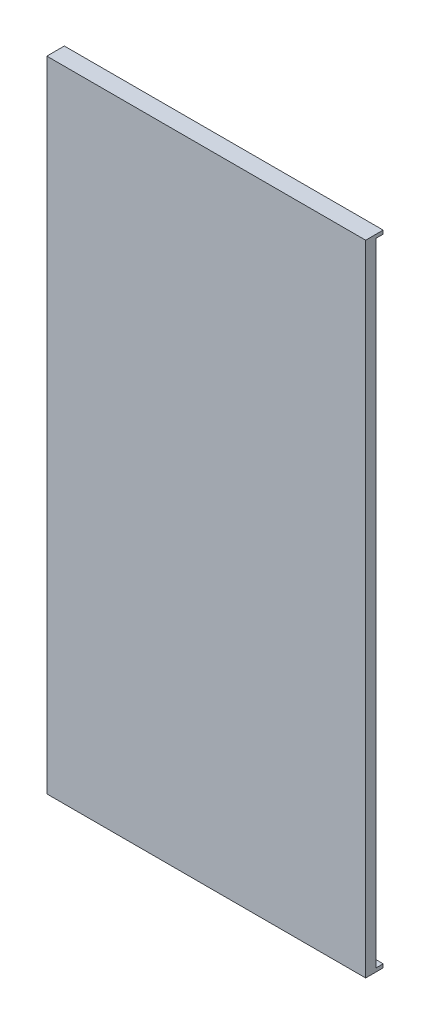
ISO-10303-21;
HEADER;
FILE_DESCRIPTION(('STEP AP214'),'2;1');
FILE_NAME('part.step','',(''),(''),'','','');
FILE_SCHEMA(('AUTOMOTIVE_DESIGN { 1 0 10303 214 1 1 1 1 }'));
ENDSEC;
DATA;
#1=APPLICATION_CONTEXT('core data for automotive mechanical design processes');
#2=APPLICATION_PROTOCOL_DEFINITION('international standard','automotive_design',2000,#1);
#3=PRODUCT_CONTEXT('',#1,'mechanical');
#4=PRODUCT('Part','Part','',(#3));
#5=PRODUCT_RELATED_PRODUCT_CATEGORY('part','',(#4));
#6=PRODUCT_DEFINITION_FORMATION('','',#4);
#7=PRODUCT_DEFINITION_CONTEXT('part definition',#1,'design');
#8=PRODUCT_DEFINITION('design','',#6,#7);
#9=PRODUCT_DEFINITION_SHAPE('','',#8);
#10=(LENGTH_UNIT() NAMED_UNIT(*) SI_UNIT(.MILLI.,.METRE.));
#11=(NAMED_UNIT(*) PLANE_ANGLE_UNIT() SI_UNIT($,.RADIAN.));
#12=(NAMED_UNIT(*) SI_UNIT($,.STERADIAN.) SOLID_ANGLE_UNIT());
#13=UNCERTAINTY_MEASURE_WITH_UNIT(LENGTH_MEASURE(1.E-05),#10,'distance_accuracy_value','');
#14=(GEOMETRIC_REPRESENTATION_CONTEXT(3) GLOBAL_UNCERTAINTY_ASSIGNED_CONTEXT((#13)) GLOBAL_UNIT_ASSIGNED_CONTEXT((#10,
#11,#12)) REPRESENTATION_CONTEXT('',''));
#15=CARTESIAN_POINT('',(0.,0.,0.));
#16=DIRECTION('',(0.,0.,1.));
#17=DIRECTION('',(1.,0.,0.));
#18=AXIS2_PLACEMENT_3D('',#15,#16,#17);
#19=CARTESIAN_POINT('',(222.,447.4,10.));
#20=DIRECTION('',(1.,0.,0.));
#21=DIRECTION('',(0.,0.,-1.));
#22=AXIS2_PLACEMENT_3D('',#19,#20,#21);
#23=PLANE('',#22);
#24=DIRECTION('',(0.,1.,0.));
#25=VECTOR('',#24,1.);
#26=CARTESIAN_POINT('',(222.,2.5,5.));
#27=LINE('',#26,#25);
#28=CARTESIAN_POINT('',(222.,2.5,5.));
#29=VERTEX_POINT('',#28);
#30=CARTESIAN_POINT('',(222.,447.4,5.));
#31=VERTEX_POINT('',#30);
#32=EDGE_CURVE('E55',#29,#31,#27,.T.);
#33=ORIENTED_EDGE('',*,*,#32,.F.);
#34=DIRECTION('',(0.,0.,-1.));
#35=VECTOR('',#34,1.);
#36=CARTESIAN_POINT('',(222.,2.5,10.));
#37=LINE('',#36,#35);
#38=CARTESIAN_POINT('',(222.,2.5,10.));
#39=VERTEX_POINT('',#38);
#40=EDGE_CURVE('E171',#39,#29,#37,.T.);
#41=ORIENTED_EDGE('',*,*,#40,.F.);
#42=DIRECTION('',(0.,-1.,0.));
#43=VECTOR('',#42,1.);
#44=CARTESIAN_POINT('',(222.,447.4,10.));
#45=LINE('',#44,#43);
#46=CARTESIAN_POINT('',(222.,447.4,10.));
#47=VERTEX_POINT('',#46);
#48=EDGE_CURVE('E158',#47,#39,#45,.T.);
#49=ORIENTED_EDGE('',*,*,#48,.F.);
#50=DIRECTION('',(0.,0.,-1.));
#51=VECTOR('',#50,1.);
#52=CARTESIAN_POINT('',(222.,447.4,10.));
#53=LINE('',#52,#51);
#54=EDGE_CURVE('E176',#47,#31,#53,.T.);
#55=ORIENTED_EDGE('',*,*,#54,.T.);
#56=EDGE_LOOP('',(#33,#41,#49,#55));
#57=FACE_BOUND('',#56,.T.);
#58=ADVANCED_FACE('F39',(#57),#23,.F.);
#59=CARTESIAN_POINT('',(0.,0.,12.33));
#60=DIRECTION('',(1.,0.,0.));
#61=DIRECTION('',(0.,0.,-1.));
#62=AXIS2_PLACEMENT_3D('',#59,#60,#61);
#63=PLANE('',#62);
#64=DIRECTION('',(0.,-1.,0.));
#65=VECTOR('',#64,1.);
#66=CARTESIAN_POINT('',(0.,0.,0.));
#67=LINE('',#66,#65);
#68=CARTESIAN_POINT('',(0.,449.9,0.));
#69=VERTEX_POINT('',#68);
#70=CARTESIAN_POINT('',(0.,0.,0.));
#71=VERTEX_POINT('',#70);
#72=EDGE_CURVE('E175',#69,#71,#67,.T.);
#73=ORIENTED_EDGE('',*,*,#72,.T.);
#74=DIRECTION('',(0.,0.,-1.));
#75=VECTOR('',#74,1.);
#76=CARTESIAN_POINT('',(0.,0.,12.33));
#77=LINE('',#76,#75);
#78=CARTESIAN_POINT('',(0.,0.,12.33));
#79=VERTEX_POINT('',#78);
#80=EDGE_CURVE('E11',#79,#71,#77,.T.);
#81=ORIENTED_EDGE('',*,*,#80,.F.);
#82=DIRECTION('',(0.,-1.,0.));
#83=VECTOR('',#82,1.);
#84=CARTESIAN_POINT('',(0.,0.,12.33));
#85=LINE('',#84,#83);
#86=CARTESIAN_POINT('',(0.,449.9,12.33));
#87=VERTEX_POINT('',#86);
#88=EDGE_CURVE('E184',#87,#79,#85,.T.);
#89=ORIENTED_EDGE('',*,*,#88,.F.);
#90=DIRECTION('',(0.,0.,-1.));
#91=VECTOR('',#90,1.);
#92=CARTESIAN_POINT('',(0.,449.9,12.33));
#93=LINE('',#92,#91);
#94=EDGE_CURVE('E198',#87,#69,#93,.T.);
#95=ORIENTED_EDGE('',*,*,#94,.T.);
#96=EDGE_LOOP('',(#73,#81,#89,#95));
#97=FACE_BOUND('',#96,.T.);
#98=ADVANCED_FACE('F41',(#97),#63,.F.);
#99=CARTESIAN_POINT('',(0.,0.,12.33));
#100=DIRECTION('',(0.,1.,0.));
#101=DIRECTION('',(0.,0.,1.));
#102=AXIS2_PLACEMENT_3D('',#99,#100,#101);
#103=PLANE('',#102);
#104=DIRECTION('',(1.,0.,0.));
#105=VECTOR('',#104,1.);
#106=CARTESIAN_POINT('',(0.,0.,0.));
#107=LINE('',#106,#105);
#108=CARTESIAN_POINT('',(224.5,0.,0.));
#109=VERTEX_POINT('',#108);
#110=EDGE_CURVE('E202',#71,#109,#107,.T.);
#111=ORIENTED_EDGE('',*,*,#110,.T.);
#112=DIRECTION('',(0.,0.,-1.));
#113=VECTOR('',#112,1.);
#114=CARTESIAN_POINT('',(224.5,0.,12.33));
#115=LINE('',#114,#113);
#116=CARTESIAN_POINT('',(224.5,0.,12.33));
#117=VERTEX_POINT('',#116);
#118=EDGE_CURVE('E48',#117,#109,#115,.T.);
#119=ORIENTED_EDGE('',*,*,#118,.F.);
#120=DIRECTION('',(1.,0.,0.));
#121=VECTOR('',#120,1.);
#122=CARTESIAN_POINT('',(0.,0.,12.33));
#123=LINE('',#122,#121);
#124=EDGE_CURVE('E188',#79,#117,#123,.T.);
#125=ORIENTED_EDGE('',*,*,#124,.F.);
#126=ORIENTED_EDGE('',*,*,#80,.T.);
#127=EDGE_LOOP('',(#111,#119,#125,#126));
#128=FACE_BOUND('',#127,.T.);
#129=ADVANCED_FACE('F249',(#128),#103,.F.);
#130=CARTESIAN_POINT('',(224.5,0.,12.33));
#131=DIRECTION('',(-1.,0.,0.));
#132=DIRECTION('',(0.,0.,1.));
#133=AXIS2_PLACEMENT_3D('',#130,#131,#132);
#134=PLANE('',#133);
#135=DIRECTION('',(0.,1.,0.));
#136=VECTOR('',#135,1.);
#137=CARTESIAN_POINT('',(224.5,0.,0.));
#138=LINE('',#137,#136);
#139=CARTESIAN_POINT('',(224.5,2.5,0.));
#140=VERTEX_POINT('',#139);
#141=EDGE_CURVE('E206',#109,#140,#138,.T.);
#142=ORIENTED_EDGE('',*,*,#141,.T.);
#143=DIRECTION('',(0.,0.,-1.));
#144=VECTOR('',#143,1.);
#145=CARTESIAN_POINT('',(224.5,2.5,5.));
#146=LINE('',#145,#144);
#147=CARTESIAN_POINT('',(224.5,2.5,5.));
#148=VERTEX_POINT('',#147);
#149=EDGE_CURVE('E127',#148,#140,#146,.T.);
#150=ORIENTED_EDGE('',*,*,#149,.F.);
#151=DIRECTION('',(0.,-1.,0.));
#152=VECTOR('',#151,1.);
#153=CARTESIAN_POINT('',(224.5,2.5,5.));
#154=LINE('',#153,#152);
#155=CARTESIAN_POINT('',(224.5,447.4,5.));
#156=VERTEX_POINT('',#155);
#157=EDGE_CURVE('E131',#156,#148,#154,.T.);
#158=ORIENTED_EDGE('',*,*,#157,.F.);
#159=DIRECTION('',(0.,0.,-1.));
#160=VECTOR('',#159,1.);
#161=CARTESIAN_POINT('',(224.5,447.4,5.));
#162=LINE('',#161,#160);
#163=CARTESIAN_POINT('',(224.5,447.4,0.));
#164=VERTEX_POINT('',#163);
#165=EDGE_CURVE('E117',#156,#164,#162,.T.);
#166=ORIENTED_EDGE('',*,*,#165,.T.);
#167=CARTESIAN_POINT('',(224.5,449.9,0.));
#168=VERTEX_POINT('',#167);
#169=EDGE_CURVE('E205',#164,#168,#138,.T.);
#170=ORIENTED_EDGE('',*,*,#169,.T.);
#171=DIRECTION('',(0.,0.,-1.));
#172=VECTOR('',#171,1.);
#173=CARTESIAN_POINT('',(224.5,449.9,12.33));
#174=LINE('',#173,#172);
#175=CARTESIAN_POINT('',(224.5,449.9,12.33));
#176=VERTEX_POINT('',#175);
#177=EDGE_CURVE('E214',#176,#168,#174,.T.);
#178=ORIENTED_EDGE('',*,*,#177,.F.);
#179=DIRECTION('',(0.,1.,0.));
#180=VECTOR('',#179,1.);
#181=CARTESIAN_POINT('',(224.5,0.,12.33));
#182=LINE('',#181,#180);
#183=EDGE_CURVE('E192',#117,#176,#182,.T.);
#184=ORIENTED_EDGE('',*,*,#183,.F.);
#185=ORIENTED_EDGE('',*,*,#118,.T.);
#186=EDGE_LOOP('',(#142,#150,#158,#166,#170,#178,#184,#185));
#187=FACE_BOUND('',#186,.T.);
#188=ADVANCED_FACE('F137',(#187),#134,.F.);
#189=CARTESIAN_POINT('',(0.,449.9,12.33));
#190=DIRECTION('',(0.,-1.,0.));
#191=DIRECTION('',(0.,0.,-1.));
#192=AXIS2_PLACEMENT_3D('',#189,#190,#191);
#193=PLANE('',#192);
#194=DIRECTION('',(-1.,0.,0.));
#195=VECTOR('',#194,1.);
#196=CARTESIAN_POINT('',(0.,449.9,0.));
#197=LINE('',#196,#195);
#198=EDGE_CURVE('E189',#168,#69,#197,.T.);
#199=ORIENTED_EDGE('',*,*,#198,.T.);
#200=ORIENTED_EDGE('',*,*,#94,.F.);
#201=DIRECTION('',(-1.,0.,0.));
#202=VECTOR('',#201,1.);
#203=CARTESIAN_POINT('',(0.,449.9,12.33));
#204=LINE('',#203,#202);
#205=EDGE_CURVE('E195',#176,#87,#204,.T.);
#206=ORIENTED_EDGE('',*,*,#205,.F.);
#207=ORIENTED_EDGE('',*,*,#177,.T.);
#208=EDGE_LOOP('',(#199,#200,#206,#207));
#209=FACE_BOUND('',#208,.T.);
#210=ADVANCED_FACE('F243',(#209),#193,.F.);
#211=CARTESIAN_POINT('',(0.,0.,12.33));
#212=DIRECTION('',(0.,0.,-1.));
#213=DIRECTION('',(-1.,0.,0.));
#214=AXIS2_PLACEMENT_3D('',#211,#212,#213);
#215=PLANE('',#214);
#216=ORIENTED_EDGE('',*,*,#88,.T.);
#217=ORIENTED_EDGE('',*,*,#124,.T.);
#218=ORIENTED_EDGE('',*,*,#183,.T.);
#219=ORIENTED_EDGE('',*,*,#205,.T.);
#220=EDGE_LOOP('',(#216,#217,#218,#219));
#221=FACE_BOUND('',#220,.T.);
#222=ADVANCED_FACE('F247',(#221),#215,.F.);
#223=CARTESIAN_POINT('',(0.,0.,0.));
#224=DIRECTION('',(0.,0.,-1.));
#225=DIRECTION('',(-1.,0.,0.));
#226=AXIS2_PLACEMENT_3D('',#223,#224,#225);
#227=PLANE('',#226);
#228=DIRECTION('',(-1.,0.,0.));
#229=VECTOR('',#228,1.);
#230=CARTESIAN_POINT('',(222.,2.5,0.));
#231=LINE('',#230,#229);
#232=CARTESIAN_POINT('',(2.5,2.5,0.));
#233=VERTEX_POINT('',#232);
#234=EDGE_CURVE('E63',#140,#233,#231,.T.);
#235=ORIENTED_EDGE('',*,*,#234,.F.);
#236=ORIENTED_EDGE('',*,*,#141,.F.);
#237=ORIENTED_EDGE('',*,*,#110,.F.);
#238=ORIENTED_EDGE('',*,*,#72,.F.);
#239=ORIENTED_EDGE('',*,*,#198,.F.);
#240=ORIENTED_EDGE('',*,*,#169,.F.);
#241=DIRECTION('',(1.,0.,0.));
#242=VECTOR('',#241,1.);
#243=CARTESIAN_POINT('',(2.5,447.4,0.));
#244=LINE('',#243,#242);
#245=CARTESIAN_POINT('',(2.5,447.4,0.));
#246=VERTEX_POINT('',#245);
#247=EDGE_CURVE('E122',#246,#164,#244,.T.);
#248=ORIENTED_EDGE('',*,*,#247,.F.);
#249=DIRECTION('',(0.,1.,0.));
#250=VECTOR('',#249,1.);
#251=CARTESIAN_POINT('',(2.5,2.5,0.));
#252=LINE('',#251,#250);
#253=EDGE_CURVE('E165',#233,#246,#252,.T.);
#254=ORIENTED_EDGE('',*,*,#253,.F.);
#255=EDGE_LOOP('',(#235,#236,#237,#238,#239,#240,#248,#254));
#256=FACE_BOUND('',#255,.T.);
#257=ADVANCED_FACE('F225',(#256),#227,.T.);
#258=CARTESIAN_POINT('',(222.,2.5,10.));
#259=DIRECTION('',(0.,-1.,0.));
#260=DIRECTION('',(0.,0.,-1.));
#261=AXIS2_PLACEMENT_3D('',#258,#259,#260);
#262=PLANE('',#261);
#263=ORIENTED_EDGE('',*,*,#234,.T.);
#264=DIRECTION('',(0.,0.,-1.));
#265=VECTOR('',#264,1.);
#266=CARTESIAN_POINT('',(2.5,2.5,10.));
#267=LINE('',#266,#265);
#268=CARTESIAN_POINT('',(2.5,2.5,10.));
#269=VERTEX_POINT('',#268);
#270=EDGE_CURVE('E162',#269,#233,#267,.T.);
#271=ORIENTED_EDGE('',*,*,#270,.F.);
#272=DIRECTION('',(-1.,0.,0.));
#273=VECTOR('',#272,1.);
#274=CARTESIAN_POINT('',(222.,2.5,10.));
#275=LINE('',#274,#273);
#276=EDGE_CURVE('E146',#39,#269,#275,.T.);
#277=ORIENTED_EDGE('',*,*,#276,.F.);
#278=ORIENTED_EDGE('',*,*,#40,.T.);
#279=DIRECTION('',(-1.,0.,0.));
#280=VECTOR('',#279,1.);
#281=CARTESIAN_POINT('',(222.,2.5,5.));
#282=LINE('',#281,#280);
#283=EDGE_CURVE('E128',#148,#29,#282,.T.);
#284=ORIENTED_EDGE('',*,*,#283,.F.);
#285=ORIENTED_EDGE('',*,*,#149,.T.);
#286=EDGE_LOOP('',(#263,#271,#277,#278,#284,#285));
#287=FACE_BOUND('',#286,.T.);
#288=ADVANCED_FACE('F228',(#287),#262,.F.);
#289=CARTESIAN_POINT('',(2.5,447.4,10.));
#290=DIRECTION('',(0.,1.,0.));
#291=DIRECTION('',(0.,0.,1.));
#292=AXIS2_PLACEMENT_3D('',#289,#290,#291);
#293=PLANE('',#292);
#294=ORIENTED_EDGE('',*,*,#247,.T.);
#295=ORIENTED_EDGE('',*,*,#165,.F.);
#296=DIRECTION('',(1.,0.,0.));
#297=VECTOR('',#296,1.);
#298=CARTESIAN_POINT('',(222.,447.4,5.));
#299=LINE('',#298,#297);
#300=EDGE_CURVE('E119',#31,#156,#299,.T.);
#301=ORIENTED_EDGE('',*,*,#300,.F.);
#302=ORIENTED_EDGE('',*,*,#54,.F.);
#303=DIRECTION('',(1.,0.,0.));
#304=VECTOR('',#303,1.);
#305=CARTESIAN_POINT('',(2.5,447.4,10.));
#306=LINE('',#305,#304);
#307=CARTESIAN_POINT('',(2.5,447.4,10.));
#308=VERTEX_POINT('',#307);
#309=EDGE_CURVE('E154',#308,#47,#306,.T.);
#310=ORIENTED_EDGE('',*,*,#309,.F.);
#311=DIRECTION('',(0.,0.,-1.));
#312=VECTOR('',#311,1.);
#313=CARTESIAN_POINT('',(2.5,447.4,10.));
#314=LINE('',#313,#312);
#315=EDGE_CURVE('E179',#308,#246,#314,.T.);
#316=ORIENTED_EDGE('',*,*,#315,.T.);
#317=EDGE_LOOP('',(#294,#295,#301,#302,#310,#316));
#318=FACE_BOUND('',#317,.T.);
#319=ADVANCED_FACE('F118',(#318),#293,.F.);
#320=CARTESIAN_POINT('',(2.5,2.5,10.));
#321=DIRECTION('',(-1.,0.,0.));
#322=DIRECTION('',(0.,0.,1.));
#323=AXIS2_PLACEMENT_3D('',#320,#321,#322);
#324=PLANE('',#323);
#325=ORIENTED_EDGE('',*,*,#253,.T.);
#326=ORIENTED_EDGE('',*,*,#315,.F.);
#327=DIRECTION('',(0.,1.,0.));
#328=VECTOR('',#327,1.);
#329=CARTESIAN_POINT('',(2.5,2.5,10.));
#330=LINE('',#329,#328);
#331=EDGE_CURVE('E150',#269,#308,#330,.T.);
#332=ORIENTED_EDGE('',*,*,#331,.F.);
#333=ORIENTED_EDGE('',*,*,#270,.T.);
#334=EDGE_LOOP('',(#325,#326,#332,#333));
#335=FACE_BOUND('',#334,.T.);
#336=ADVANCED_FACE('F238',(#335),#324,.F.);
#337=CARTESIAN_POINT('',(0.,0.,10.));
#338=DIRECTION('',(0.,0.,-1.));
#339=DIRECTION('',(-1.,0.,0.));
#340=AXIS2_PLACEMENT_3D('',#337,#338,#339);
#341=PLANE('',#340);
#342=ORIENTED_EDGE('',*,*,#276,.T.);
#343=ORIENTED_EDGE('',*,*,#331,.T.);
#344=ORIENTED_EDGE('',*,*,#309,.T.);
#345=ORIENTED_EDGE('',*,*,#48,.T.);
#346=EDGE_LOOP('',(#342,#343,#344,#345));
#347=FACE_BOUND('',#346,.T.);
#348=ADVANCED_FACE('F235',(#347),#341,.T.);
#349=CARTESIAN_POINT('',(0.,0.,5.));
#350=DIRECTION('',(0.,0.,-1.));
#351=DIRECTION('',(-1.,0.,0.));
#352=AXIS2_PLACEMENT_3D('',#349,#350,#351);
#353=PLANE('',#352);
#354=ORIENTED_EDGE('',*,*,#32,.T.);
#355=ORIENTED_EDGE('',*,*,#300,.T.);
#356=ORIENTED_EDGE('',*,*,#157,.T.);
#357=ORIENTED_EDGE('',*,*,#283,.T.);
#358=EDGE_LOOP('',(#354,#355,#356,#357));
#359=FACE_BOUND('',#358,.T.);
#360=ADVANCED_FACE('F130',(#359),#353,.T.);
#361=CLOSED_SHELL('',(#58,#98,#129,#188,#210,#222,#257,#288,#319,#336,#348,#360));
#362=MANIFOLD_SOLID_BREP('B2',#361);
#363=ADVANCED_BREP_SHAPE_REPRESENTATION('',(#18,#362),#14);
#364=SHAPE_DEFINITION_REPRESENTATION(#9,#363);
ENDSEC;
END-ISO-10303-21;
